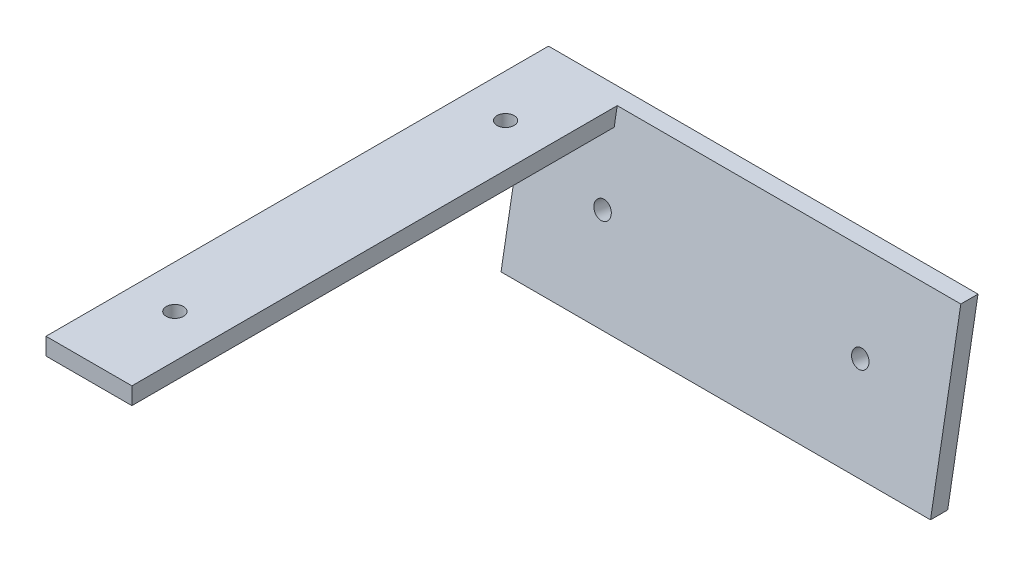
ISO-10303-21;
HEADER;
FILE_DESCRIPTION(('STEP AP214'),'2;1');
FILE_NAME('part.step','',(''),(''),'','','');
FILE_SCHEMA(('AUTOMOTIVE_DESIGN { 1 0 10303 214 1 1 1 1 }'));
ENDSEC;
DATA;
#1=APPLICATION_CONTEXT('core data for automotive mechanical design processes');
#2=APPLICATION_PROTOCOL_DEFINITION('international standard','automotive_design',2000,#1);
#3=PRODUCT_CONTEXT('',#1,'mechanical');
#4=PRODUCT('Part','Part','',(#3));
#5=PRODUCT_RELATED_PRODUCT_CATEGORY('part','',(#4));
#6=PRODUCT_DEFINITION_FORMATION('','',#4);
#7=PRODUCT_DEFINITION_CONTEXT('part definition',#1,'design');
#8=PRODUCT_DEFINITION('design','',#6,#7);
#9=PRODUCT_DEFINITION_SHAPE('','',#8);
#10=(LENGTH_UNIT() NAMED_UNIT(*) SI_UNIT(.MILLI.,.METRE.));
#11=(NAMED_UNIT(*) PLANE_ANGLE_UNIT() SI_UNIT($,.RADIAN.));
#12=(NAMED_UNIT(*) SI_UNIT($,.STERADIAN.) SOLID_ANGLE_UNIT());
#13=UNCERTAINTY_MEASURE_WITH_UNIT(LENGTH_MEASURE(1.E-05),#10,'distance_accuracy_value','');
#14=(GEOMETRIC_REPRESENTATION_CONTEXT(3) GLOBAL_UNCERTAINTY_ASSIGNED_CONTEXT((#13)) GLOBAL_UNIT_ASSIGNED_CONTEXT((#10,
#11,#12)) REPRESENTATION_CONTEXT('',''));
#15=CARTESIAN_POINT('',(0.,0.,0.));
#16=DIRECTION('',(0.,0.,1.));
#17=DIRECTION('',(1.,0.,0.));
#18=AXIS2_PLACEMENT_3D('',#15,#16,#17);
#19=CARTESIAN_POINT('',(10.,18.,0.));
#20=DIRECTION('',(0.,-1.,0.));
#21=DIRECTION('',(0.,0.,-1.));
#22=AXIS2_PLACEMENT_3D('',#19,#20,#21);
#23=PLANE('',#22);
#24=CARTESIAN_POINT('',(5.,18.,42.9734603858306));
#25=DIRECTION('',(0.,-1.,0.));
#26=DIRECTION('',(0.,0.,-1.));
#27=AXIS2_PLACEMENT_3D('',#24,#25,#26);
#28=CIRCLE('',#27,1.);
#29=CARTESIAN_POINT('',(5.,18.,41.9734603858306));
#30=VERTEX_POINT('',#29);
#31=EDGE_CURVE('E147',#30,#30,#28,.T.);
#32=ORIENTED_EDGE('',*,*,#31,.F.);
#33=EDGE_LOOP('',(#32));
#34=FACE_BOUND('',#33,.T.);
#35=CARTESIAN_POINT('',(5.,18.,4.47346038583062));
#36=DIRECTION('',(0.,-1.,0.));
#37=DIRECTION('',(0.,0.,-1.));
#38=AXIS2_PLACEMENT_3D('',#35,#36,#37);
#39=CIRCLE('',#38,1.);
#40=CARTESIAN_POINT('',(5.,18.,3.47346038583062));
#41=VERTEX_POINT('',#40);
#42=EDGE_CURVE('E212',#41,#41,#39,.T.);
#43=ORIENTED_EDGE('',*,*,#42,.F.);
#44=EDGE_LOOP('',(#43));
#45=FACE_BOUND('',#44,.T.);
#46=DIRECTION('',(0.,0.,1.));
#47=VECTOR('',#46,1.);
#48=CARTESIAN_POINT('',(0.,18.,0.));
#49=LINE('',#48,#47);
#50=CARTESIAN_POINT('',(0.,18.,-3.17388565275244));
#51=VERTEX_POINT('',#50);
#52=CARTESIAN_POINT('',(0.,18.,52.9734603858306));
#53=VERTEX_POINT('',#52);
#54=EDGE_CURVE('E119',#51,#53,#49,.T.);
#55=ORIENTED_EDGE('',*,*,#54,.F.);
#56=DIRECTION('',(-1.,0.,0.));
#57=VECTOR('',#56,1.);
#58=CARTESIAN_POINT('',(10.,18.,-3.17388565275244));
#59=LINE('',#58,#57);
#60=CARTESIAN_POINT('',(10.,18.,-3.17388565275244));
#61=VERTEX_POINT('',#60);
#62=EDGE_CURVE('E11',#61,#51,#59,.T.);
#63=ORIENTED_EDGE('',*,*,#62,.F.);
#64=DIRECTION('',(0.,0.,1.));
#65=VECTOR('',#64,1.);
#66=CARTESIAN_POINT('',(10.,18.,0.));
#67=LINE('',#66,#65);
#68=CARTESIAN_POINT('',(10.,18.,52.9734603858306));
#69=VERTEX_POINT('',#68);
#70=EDGE_CURVE('E161',#61,#69,#67,.T.);
#71=ORIENTED_EDGE('',*,*,#70,.T.);
#72=DIRECTION('',(-1.,0.,0.));
#73=VECTOR('',#72,1.);
#74=CARTESIAN_POINT('',(10.,18.,52.9734603858306));
#75=LINE('',#74,#73);
#76=EDGE_CURVE('E62',#69,#53,#75,.T.);
#77=ORIENTED_EDGE('',*,*,#76,.T.);
#78=EDGE_LOOP('',(#55,#63,#71,#77));
#79=FACE_BOUND('',#78,.T.);
#80=ADVANCED_FACE('F45',(#34,#45,#79),#23,.T.);
#81=CARTESIAN_POINT('',(10.,20.,0.));
#82=DIRECTION('',(0.,1.,0.));
#83=DIRECTION('',(0.,0.,1.));
#84=AXIS2_PLACEMENT_3D('',#81,#82,#83);
#85=PLANE('',#84);
#86=CARTESIAN_POINT('',(5.,20.,42.9734603858306));
#87=DIRECTION('',(0.,1.,0.));
#88=DIRECTION('',(0.,0.,1.));
#89=AXIS2_PLACEMENT_3D('',#86,#87,#88);
#90=CIRCLE('',#89,1.);
#91=CARTESIAN_POINT('',(5.,20.,43.9734603858306));
#92=VERTEX_POINT('',#91);
#93=EDGE_CURVE('E348',#92,#92,#90,.T.);
#94=ORIENTED_EDGE('',*,*,#93,.F.);
#95=EDGE_LOOP('',(#94));
#96=FACE_BOUND('',#95,.T.);
#97=CARTESIAN_POINT('',(5.,20.,4.47346038583062));
#98=DIRECTION('',(0.,1.,0.));
#99=DIRECTION('',(0.,0.,1.));
#100=AXIS2_PLACEMENT_3D('',#97,#98,#99);
#101=CIRCLE('',#100,1.);
#102=CARTESIAN_POINT('',(5.,20.,5.47346038583062));
#103=VERTEX_POINT('',#102);
#104=EDGE_CURVE('E347',#103,#103,#101,.T.);
#105=ORIENTED_EDGE('',*,*,#104,.F.);
#106=EDGE_LOOP('',(#105));
#107=FACE_BOUND('',#106,.T.);
#108=DIRECTION('',(0.,0.,-1.));
#109=VECTOR('',#108,1.);
#110=CARTESIAN_POINT('',(0.,20.,0.));
#111=LINE('',#110,#109);
#112=CARTESIAN_POINT('',(0.,20.,52.9734603858306));
#113=VERTEX_POINT('',#112);
#114=CARTESIAN_POINT('',(0.,20.,-5.52653961416938));
#115=VERTEX_POINT('',#114);
#116=EDGE_CURVE('E177',#113,#115,#111,.T.);
#117=ORIENTED_EDGE('',*,*,#116,.F.);
#118=DIRECTION('',(-1.,0.,0.));
#119=VECTOR('',#118,1.);
#120=CARTESIAN_POINT('',(10.,20.,52.9734603858306));
#121=LINE('',#120,#119);
#122=CARTESIAN_POINT('',(10.,20.,52.9734603858306));
#123=VERTEX_POINT('',#122);
#124=EDGE_CURVE('E54',#123,#113,#121,.T.);
#125=ORIENTED_EDGE('',*,*,#124,.F.);
#126=DIRECTION('',(0.,0.,-1.));
#127=VECTOR('',#126,1.);
#128=CARTESIAN_POINT('',(10.,20.,0.));
#129=LINE('',#128,#127);
#130=CARTESIAN_POINT('',(10.,20.,-3.52653961416938));
#131=VERTEX_POINT('',#130);
#132=EDGE_CURVE('E168',#123,#131,#129,.T.);
#133=ORIENTED_EDGE('',*,*,#132,.T.);
#134=DIRECTION('',(-1.,0.,0.));
#135=VECTOR('',#134,1.);
#136=CARTESIAN_POINT('',(50.,20.,-3.52653961416938));
#137=LINE('',#136,#135);
#138=CARTESIAN_POINT('',(50.,20.,-3.52653961416938));
#139=VERTEX_POINT('',#138);
#140=EDGE_CURVE('E143',#139,#131,#137,.T.);
#141=ORIENTED_EDGE('',*,*,#140,.F.);
#142=DIRECTION('',(0.,0.,-1.));
#143=VECTOR('',#142,1.);
#144=CARTESIAN_POINT('',(50.,20.,0.));
#145=LINE('',#144,#143);
#146=CARTESIAN_POINT('',(50.,20.,-5.52653961416938));
#147=VERTEX_POINT('',#146);
#148=EDGE_CURVE('E129',#139,#147,#145,.T.);
#149=ORIENTED_EDGE('',*,*,#148,.T.);
#150=DIRECTION('',(-1.,0.,0.));
#151=VECTOR('',#150,1.);
#152=CARTESIAN_POINT('',(50.,20.,-5.52653961416938));
#153=LINE('',#152,#151);
#154=EDGE_CURVE('E155',#147,#115,#153,.T.);
#155=ORIENTED_EDGE('',*,*,#154,.T.);
#156=EDGE_LOOP('',(#117,#125,#133,#141,#149,#155));
#157=FACE_BOUND('',#156,.T.);
#158=ADVANCED_FACE('F190',(#96,#107,#157),#85,.T.);
#159=CARTESIAN_POINT('',(10.,0.,52.9734603858306));
#160=DIRECTION('',(0.,0.,1.));
#161=DIRECTION('',(1.,0.,0.));
#162=AXIS2_PLACEMENT_3D('',#159,#160,#161);
#163=PLANE('',#162);
#164=DIRECTION('',(0.,1.,0.));
#165=VECTOR('',#164,1.);
#166=CARTESIAN_POINT('',(0.,0.,52.9734603858306));
#167=LINE('',#166,#165);
#168=EDGE_CURVE('E165',#53,#113,#167,.T.);
#169=ORIENTED_EDGE('',*,*,#168,.F.);
#170=ORIENTED_EDGE('',*,*,#76,.F.);
#171=DIRECTION('',(0.,1.,0.));
#172=VECTOR('',#171,1.);
#173=CARTESIAN_POINT('',(10.,0.,52.9734603858306));
#174=LINE('',#173,#172);
#175=EDGE_CURVE('E172',#69,#123,#174,.T.);
#176=ORIENTED_EDGE('',*,*,#175,.T.);
#177=ORIENTED_EDGE('',*,*,#124,.T.);
#178=EDGE_LOOP('',(#169,#170,#176,#177));
#179=FACE_BOUND('',#178,.T.);
#180=ADVANCED_FACE('F187',(#179),#163,.T.);
#181=CARTESIAN_POINT('',(10.,0.,0.));
#182=DIRECTION('',(1.,0.,0.));
#183=DIRECTION('',(0.,0.,-1.));
#184=AXIS2_PLACEMENT_3D('',#181,#182,#183);
#185=PLANE('',#184);
#186=ORIENTED_EDGE('',*,*,#70,.F.);
#187=DIRECTION('',(0.,0.984807753012207,-0.173648177666934));
#188=VECTOR('',#187,1.);
#189=CARTESIAN_POINT('',(10.,0.,0.));
#190=LINE('',#189,#188);
#191=EDGE_CURVE('E164',#61,#131,#190,.T.);
#192=ORIENTED_EDGE('',*,*,#191,.T.);
#193=ORIENTED_EDGE('',*,*,#132,.F.);
#194=ORIENTED_EDGE('',*,*,#175,.F.);
#195=EDGE_LOOP('',(#186,#192,#193,#194));
#196=FACE_BOUND('',#195,.T.);
#197=ADVANCED_FACE('F189',(#196),#185,.T.);
#198=CARTESIAN_POINT('',(0.,0.,0.));
#199=DIRECTION('',(1.,0.,0.));
#200=DIRECTION('',(0.,0.,-1.));
#201=AXIS2_PLACEMENT_3D('',#198,#199,#200);
#202=PLANE('',#201);
#203=ORIENTED_EDGE('',*,*,#54,.T.);
#204=ORIENTED_EDGE('',*,*,#168,.T.);
#205=ORIENTED_EDGE('',*,*,#116,.T.);
#206=DIRECTION('',(0.,-0.984807753012208,0.173648177666934));
#207=VECTOR('',#206,1.);
#208=CARTESIAN_POINT('',(0.,-0.342020143325676,-1.93969262078591));
#209=LINE('',#208,#207);
#210=CARTESIAN_POINT('',(0.,0.,-2.));
#211=VERTEX_POINT('',#210);
#212=EDGE_CURVE('E131',#115,#211,#209,.T.);
#213=ORIENTED_EDGE('',*,*,#212,.T.);
#214=DIRECTION('',(0.,0.,1.));
#215=VECTOR('',#214,1.);
#216=CARTESIAN_POINT('',(0.,0.,0.));
#217=LINE('',#216,#215);
#218=CARTESIAN_POINT('',(0.,0.,0.));
#219=VERTEX_POINT('',#218);
#220=EDGE_CURVE('E146',#211,#219,#217,.T.);
#221=ORIENTED_EDGE('',*,*,#220,.T.);
#222=DIRECTION('',(0.,0.984807753012207,-0.173648177666934));
#223=VECTOR('',#222,1.);
#224=CARTESIAN_POINT('',(0.,0.,0.));
#225=LINE('',#224,#223);
#226=EDGE_CURVE('E113',#219,#51,#225,.T.);
#227=ORIENTED_EDGE('',*,*,#226,.T.);
#228=EDGE_LOOP('',(#203,#204,#205,#213,#221,#227));
#229=FACE_BOUND('',#228,.T.);
#230=ADVANCED_FACE('F186',(#229),#202,.F.);
#231=CARTESIAN_POINT('',(50.,0.,0.));
#232=DIRECTION('',(0.,0.173648177666934,0.984807753012207));
#233=DIRECTION('',(0.,-0.984807753012207,0.173648177666934));
#234=AXIS2_PLACEMENT_3D('',#231,#232,#233);
#235=PLANE('',#234);
#236=CARTESIAN_POINT('',(40.,10.3420201433257,-1.82357718629878));
#237=DIRECTION('',(0.,0.173648177666934,0.984807753012207));
#238=DIRECTION('',(0.,-0.984807753012207,0.173648177666934));
#239=AXIS2_PLACEMENT_3D('',#236,#237,#238);
#240=CIRCLE('',#239,0.999999999999998);
#241=CARTESIAN_POINT('',(40.,9.35721239031347,-1.64992900863185));
#242=VERTEX_POINT('',#241);
#243=EDGE_CURVE('E331',#242,#242,#240,.T.);
#244=ORIENTED_EDGE('',*,*,#243,.F.);
#245=EDGE_LOOP('',(#244));
#246=FACE_BOUND('',#245,.T.);
#247=CARTESIAN_POINT('',(10.,10.3420201433257,-1.82357718629878));
#248=DIRECTION('',(0.,0.173648177666934,0.984807753012207));
#249=DIRECTION('',(0.,-0.984807753012207,0.173648177666934));
#250=AXIS2_PLACEMENT_3D('',#247,#248,#249);
#251=CIRCLE('',#250,1.);
#252=CARTESIAN_POINT('',(10.,9.35721239031348,-1.64992900863185));
#253=VERTEX_POINT('',#252);
#254=EDGE_CURVE('E335',#253,#253,#251,.T.);
#255=ORIENTED_EDGE('',*,*,#254,.F.);
#256=EDGE_LOOP('',(#255));
#257=FACE_BOUND('',#256,.T.);
#258=ORIENTED_EDGE('',*,*,#191,.F.);
#259=ORIENTED_EDGE('',*,*,#62,.T.);
#260=ORIENTED_EDGE('',*,*,#226,.F.);
#261=DIRECTION('',(-1.,0.,0.));
#262=VECTOR('',#261,1.);
#263=CARTESIAN_POINT('',(50.,0.,0.));
#264=LINE('',#263,#262);
#265=CARTESIAN_POINT('',(50.,0.,0.));
#266=VERTEX_POINT('',#265);
#267=EDGE_CURVE('E105',#266,#219,#264,.T.);
#268=ORIENTED_EDGE('',*,*,#267,.F.);
#269=DIRECTION('',(0.,0.984807753012207,-0.173648177666934));
#270=VECTOR('',#269,1.);
#271=CARTESIAN_POINT('',(50.,0.,0.));
#272=LINE('',#271,#270);
#273=EDGE_CURVE('E110',#266,#139,#272,.T.);
#274=ORIENTED_EDGE('',*,*,#273,.T.);
#275=ORIENTED_EDGE('',*,*,#140,.T.);
#276=EDGE_LOOP('',(#258,#259,#260,#268,#274,#275));
#277=FACE_BOUND('',#276,.T.);
#278=ADVANCED_FACE('F108',(#246,#257,#277),#235,.T.);
#279=CARTESIAN_POINT('',(50.,0.,0.));
#280=DIRECTION('',(0.,-1.,0.));
#281=DIRECTION('',(0.,0.,-1.));
#282=AXIS2_PLACEMENT_3D('',#279,#280,#281);
#283=PLANE('',#282);
#284=ORIENTED_EDGE('',*,*,#220,.F.);
#285=DIRECTION('',(-1.,0.,0.));
#286=VECTOR('',#285,1.);
#287=CARTESIAN_POINT('',(50.,0.,-2.));
#288=LINE('',#287,#286);
#289=CARTESIAN_POINT('',(50.,0.,-2.));
#290=VERTEX_POINT('',#289);
#291=EDGE_CURVE('E120',#290,#211,#288,.T.);
#292=ORIENTED_EDGE('',*,*,#291,.F.);
#293=DIRECTION('',(0.,0.,1.));
#294=VECTOR('',#293,1.);
#295=CARTESIAN_POINT('',(50.,0.,0.));
#296=LINE('',#295,#294);
#297=EDGE_CURVE('E126',#290,#266,#296,.T.);
#298=ORIENTED_EDGE('',*,*,#297,.T.);
#299=ORIENTED_EDGE('',*,*,#267,.T.);
#300=EDGE_LOOP('',(#284,#292,#298,#299));
#301=FACE_BOUND('',#300,.T.);
#302=ADVANCED_FACE('F133',(#301),#283,.T.);
#303=CARTESIAN_POINT('',(50.,-0.342020143325676,-1.93969262078591));
#304=DIRECTION('',(0.,-0.173648177666934,-0.984807753012207));
#305=DIRECTION('',(0.,0.984807753012207,-0.173648177666934));
#306=AXIS2_PLACEMENT_3D('',#303,#304,#305);
#307=PLANE('',#306);
#308=CARTESIAN_POINT('',(40.,10.,-3.76326980708469));
#309=DIRECTION('',(0.,-0.173648177666934,-0.984807753012208));
#310=DIRECTION('',(0.,0.984807753012208,-0.173648177666934));
#311=AXIS2_PLACEMENT_3D('',#308,#309,#310);
#312=CIRCLE('',#311,0.999999999999998);
#313=CARTESIAN_POINT('',(40.,10.9848077530122,-3.93691798475162));
#314=VERTEX_POINT('',#313);
#315=EDGE_CURVE('E333',#314,#314,#312,.T.);
#316=ORIENTED_EDGE('',*,*,#315,.F.);
#317=EDGE_LOOP('',(#316));
#318=FACE_BOUND('',#317,.T.);
#319=CARTESIAN_POINT('',(10.,10.,-3.76326980708469));
#320=DIRECTION('',(0.,-0.173648177666934,-0.984807753012208));
#321=DIRECTION('',(0.,0.984807753012208,-0.173648177666934));
#322=AXIS2_PLACEMENT_3D('',#319,#320,#321);
#323=CIRCLE('',#322,1.);
#324=CARTESIAN_POINT('',(10.,10.9848077530122,-3.93691798475163));
#325=VERTEX_POINT('',#324);
#326=EDGE_CURVE('E336',#325,#325,#323,.T.);
#327=ORIENTED_EDGE('',*,*,#326,.F.);
#328=EDGE_LOOP('',(#327));
#329=FACE_BOUND('',#328,.T.);
#330=ORIENTED_EDGE('',*,*,#212,.F.);
#331=ORIENTED_EDGE('',*,*,#154,.F.);
#332=DIRECTION('',(0.,-0.984807753012208,0.173648177666934));
#333=VECTOR('',#332,1.);
#334=CARTESIAN_POINT('',(50.,-0.342020143325676,-1.93969262078591));
#335=LINE('',#334,#333);
#336=EDGE_CURVE('E135',#147,#290,#335,.T.);
#337=ORIENTED_EDGE('',*,*,#336,.T.);
#338=ORIENTED_EDGE('',*,*,#291,.T.);
#339=EDGE_LOOP('',(#330,#331,#337,#338));
#340=FACE_BOUND('',#339,.T.);
#341=ADVANCED_FACE('F215',(#318,#329,#340),#307,.T.);
#342=CARTESIAN_POINT('',(50.,0.,0.));
#343=DIRECTION('',(1.,0.,0.));
#344=DIRECTION('',(0.,0.,-1.));
#345=AXIS2_PLACEMENT_3D('',#342,#343,#344);
#346=PLANE('',#345);
#347=ORIENTED_EDGE('',*,*,#273,.F.);
#348=ORIENTED_EDGE('',*,*,#297,.F.);
#349=ORIENTED_EDGE('',*,*,#336,.F.);
#350=ORIENTED_EDGE('',*,*,#148,.F.);
#351=EDGE_LOOP('',(#347,#348,#349,#350));
#352=FACE_BOUND('',#351,.T.);
#353=ADVANCED_FACE('F124',(#352),#346,.T.);
#354=CARTESIAN_POINT('',(5.,-30.,4.47346038583062));
#355=DIRECTION('',(0.,1.,0.));
#356=DIRECTION('',(0.,0.,1.));
#357=AXIS2_PLACEMENT_3D('',#354,#355,#356);
#358=CYLINDRICAL_SURFACE('',#357,1.);
#359=ORIENTED_EDGE('',*,*,#42,.T.);
#360=EDGE_LOOP('',(#359));
#361=FACE_BOUND('',#360,.T.);
#362=ORIENTED_EDGE('',*,*,#104,.T.);
#363=EDGE_LOOP('',(#362));
#364=FACE_BOUND('',#363,.T.);
#365=ADVANCED_FACE('F227',(#361,#364),#358,.F.);
#366=CARTESIAN_POINT('',(5.,-30.,42.9734603858306));
#367=DIRECTION('',(0.,1.,0.));
#368=DIRECTION('',(0.,0.,1.));
#369=AXIS2_PLACEMENT_3D('',#366,#367,#368);
#370=CYLINDRICAL_SURFACE('',#369,1.);
#371=ORIENTED_EDGE('',*,*,#31,.T.);
#372=EDGE_LOOP('',(#371));
#373=FACE_BOUND('',#372,.T.);
#374=ORIENTED_EDGE('',*,*,#93,.T.);
#375=EDGE_LOOP('',(#374));
#376=FACE_BOUND('',#375,.T.);
#377=ADVANCED_FACE('F291',(#373,#376),#370,.F.);
#378=CARTESIAN_POINT('',(10.,10.3472963553339,-1.79365430106028));
#379=DIRECTION('',(0.,-0.173648177666934,-0.984807753012207));
#380=DIRECTION('',(0.,0.984807753012208,-0.173648177666934));
#381=AXIS2_PLACEMENT_3D('',#378,#379,#380);
#382=CYLINDRICAL_SURFACE('',#381,1.);
#383=ORIENTED_EDGE('',*,*,#254,.T.);
#384=EDGE_LOOP('',(#383));
#385=FACE_BOUND('',#384,.T.);
#386=ORIENTED_EDGE('',*,*,#326,.T.);
#387=EDGE_LOOP('',(#386));
#388=FACE_BOUND('',#387,.T.);
#389=ADVANCED_FACE('F299',(#385,#388),#382,.F.);
#390=CARTESIAN_POINT('',(40.,10.3472963553339,-1.79365430106028));
#391=DIRECTION('',(0.,-0.173648177666934,-0.984807753012207));
#392=DIRECTION('',(0.,0.984807753012208,-0.173648177666934));
#393=AXIS2_PLACEMENT_3D('',#390,#391,#392);
#394=CYLINDRICAL_SURFACE('',#393,0.999999999999998);
#395=ORIENTED_EDGE('',*,*,#243,.T.);
#396=EDGE_LOOP('',(#395));
#397=FACE_BOUND('',#396,.T.);
#398=ORIENTED_EDGE('',*,*,#315,.T.);
#399=EDGE_LOOP('',(#398));
#400=FACE_BOUND('',#399,.T.);
#401=ADVANCED_FACE('F308',(#397,#400),#394,.F.);
#402=CLOSED_SHELL('',(#80,#158,#180,#197,#230,#278,#302,#341,#353,#365,#377,#389,#401));
#403=MANIFOLD_SOLID_BREP('B2',#402);
#404=ADVANCED_BREP_SHAPE_REPRESENTATION('',(#18,#403),#14);
#405=SHAPE_DEFINITION_REPRESENTATION(#9,#404);
ENDSEC;
END-ISO-10303-21;
